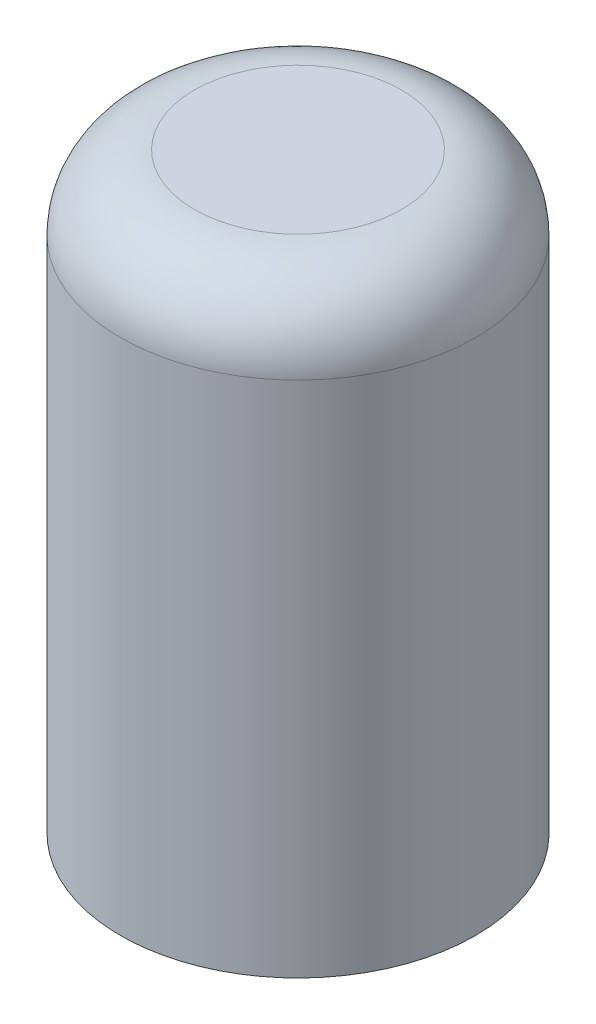
ISO-10303-21;
HEADER;
FILE_DESCRIPTION(('STEP AP214'),'2;1');
FILE_NAME('part.step','',(''),(''),'','','');
FILE_SCHEMA(('AUTOMOTIVE_DESIGN { 1 0 10303 214 1 1 1 1 }'));
ENDSEC;
DATA;
#1=APPLICATION_CONTEXT('core data for automotive mechanical design processes');
#2=APPLICATION_PROTOCOL_DEFINITION('international standard','automotive_design',2000,#1);
#3=PRODUCT_CONTEXT('',#1,'mechanical');
#4=PRODUCT('Part','Part','',(#3));
#5=PRODUCT_RELATED_PRODUCT_CATEGORY('part','',(#4));
#6=PRODUCT_DEFINITION_FORMATION('','',#4);
#7=PRODUCT_DEFINITION_CONTEXT('part definition',#1,'design');
#8=PRODUCT_DEFINITION('design','',#6,#7);
#9=PRODUCT_DEFINITION_SHAPE('','',#8);
#10=(LENGTH_UNIT() NAMED_UNIT(*) SI_UNIT(.MILLI.,.METRE.));
#11=(NAMED_UNIT(*) PLANE_ANGLE_UNIT() SI_UNIT($,.RADIAN.));
#12=(NAMED_UNIT(*) SI_UNIT($,.STERADIAN.) SOLID_ANGLE_UNIT());
#13=UNCERTAINTY_MEASURE_WITH_UNIT(LENGTH_MEASURE(1.E-05),#10,'distance_accuracy_value','');
#14=(GEOMETRIC_REPRESENTATION_CONTEXT(3) GLOBAL_UNCERTAINTY_ASSIGNED_CONTEXT((#13)) GLOBAL_UNIT_ASSIGNED_CONTEXT((#10,
#11,#12)) REPRESENTATION_CONTEXT('',''));
#15=CARTESIAN_POINT('',(0.,0.,0.));
#16=DIRECTION('',(0.,0.,1.));
#17=DIRECTION('',(1.,0.,0.));
#18=AXIS2_PLACEMENT_3D('',#15,#16,#17);
#19=CARTESIAN_POINT('',(0.,0.,0.));
#20=DIRECTION('',(0.,1.,0.));
#21=DIRECTION('',(-1.,0.,0.));
#22=AXIS2_PLACEMENT_3D('',#19,#20,#21);
#23=PLANE('',#22);
#24=CARTESIAN_POINT('',(0.,0.,0.));
#25=DIRECTION('',(0.,1.,0.));
#26=DIRECTION('',(-1.,0.,0.));
#27=AXIS2_PLACEMENT_3D('',#24,#25,#26);
#28=CIRCLE('',#27,57.9999999999998);
#29=CARTESIAN_POINT('',(-57.9999999999998,2.56578741862219E-13,0.));
#30=VERTEX_POINT('',#29);
#31=EDGE_CURVE('E45',#30,#30,#28,.T.);
#32=ORIENTED_EDGE('',*,*,#31,.T.);
#33=EDGE_LOOP('',(#32));
#34=FACE_BOUND('',#33,.T.);
#35=CARTESIAN_POINT('',(0.,1.66533453693773E-13,0.));
#36=DIRECTION('',(0.,1.,0.));
#37=DIRECTION('',(-1.,0.,0.));
#38=AXIS2_PLACEMENT_3D('',#35,#36,#37);
#39=CIRCLE('',#38,60.0000000000001);
#40=CARTESIAN_POINT('',(-60.0000000000001,3.45821745088946E-13,0.));
#41=VERTEX_POINT('',#40);
#42=EDGE_CURVE('E10',#41,#41,#39,.T.);
#43=ORIENTED_EDGE('',*,*,#42,.F.);
#44=EDGE_LOOP('',(#43));
#45=FACE_BOUND('',#44,.T.);
#46=ADVANCED_FACE('F31',(#34,#45),#23,.F.);
#47=CARTESIAN_POINT('',(5.97627637983908E-13,200.,0.));
#48=DIRECTION('',(0.,1.,0.));
#49=DIRECTION('',(-1.,0.,0.));
#50=AXIS2_PLACEMENT_3D('',#47,#48,#49);
#51=CYLINDRICAL_SURFACE('',#50,59.9999999999998);
#52=CARTESIAN_POINT('',(5.2292418323592E-13,175.,0.));
#53=DIRECTION('',(0.,1.,0.));
#54=DIRECTION('',(-1.,0.,0.));
#55=AXIS2_PLACEMENT_3D('',#52,#53,#54);
#56=CIRCLE('',#55,59.9999999999995);
#57=CARTESIAN_POINT('',(-59.999999999999,175.,0.));
#58=VERTEX_POINT('',#57);
#59=EDGE_CURVE('E37',#58,#58,#56,.T.);
#60=ORIENTED_EDGE('',*,*,#59,.F.);
#61=EDGE_LOOP('',(#60));
#62=FACE_BOUND('',#61,.T.);
#63=ORIENTED_EDGE('',*,*,#42,.T.);
#64=EDGE_LOOP('',(#63));
#65=FACE_BOUND('',#64,.T.);
#66=ADVANCED_FACE('F74',(#62,#65),#51,.T.);
#67=CARTESIAN_POINT('',(5.20417042793042E-13,175.,0.));
#68=DIRECTION('',(0.,1.,0.));
#69=DIRECTION('',(-1.,0.,0.));
#70=AXIS2_PLACEMENT_3D('',#67,#68,#69);
#71=TOROIDAL_SURFACE('',#70,34.9999999999995,25.);
#72=CARTESIAN_POINT('',(5.97627637983908E-13,200.,0.));
#73=DIRECTION('',(0.,1.,0.));
#74=DIRECTION('',(-1.,0.,0.));
#75=AXIS2_PLACEMENT_3D('',#72,#73,#74);
#76=CIRCLE('',#75,34.9999999999994);
#77=CARTESIAN_POINT('',(-34.9999999999988,200.,0.));
#78=VERTEX_POINT('',#77);
#79=EDGE_CURVE('E41',#78,#78,#76,.T.);
#80=ORIENTED_EDGE('',*,*,#79,.F.);
#81=EDGE_LOOP('',(#80));
#82=FACE_BOUND('',#81,.T.);
#83=ORIENTED_EDGE('',*,*,#59,.T.);
#84=EDGE_LOOP('',(#83));
#85=FACE_BOUND('',#84,.T.);
#86=ADVANCED_FACE('F79',(#82,#85),#71,.T.);
#87=CARTESIAN_POINT('',(35.,200.,0.));
#88=DIRECTION('',(0.,-1.,0.));
#89=DIRECTION('',(1.,0.,0.));
#90=AXIS2_PLACEMENT_3D('',#87,#88,#89);
#91=PLANE('',#90);
#92=ORIENTED_EDGE('',*,*,#79,.T.);
#93=EDGE_LOOP('',(#92));
#94=FACE_BOUND('',#93,.T.);
#95=ADVANCED_FACE('F71',(#94),#91,.F.);
#96=CARTESIAN_POINT('',(5.97627637983908E-13,200.,0.));
#97=DIRECTION('',(0.,1.,0.));
#98=DIRECTION('',(-1.,0.,0.));
#99=AXIS2_PLACEMENT_3D('',#96,#97,#98);
#100=CYLINDRICAL_SURFACE('',#99,57.9999999999998);
#101=CARTESIAN_POINT('',(5.20417042793042E-13,175.,0.));
#102=DIRECTION('',(0.,1.,0.));
#103=DIRECTION('',(-1.,0.,0.));
#104=AXIS2_PLACEMENT_3D('',#101,#102,#103);
#105=CIRCLE('',#104,57.9999999999995);
#106=CARTESIAN_POINT('',(-57.999999999999,175.,0.));
#107=VERTEX_POINT('',#106);
#108=EDGE_CURVE('E50',#107,#107,#105,.T.);
#109=ORIENTED_EDGE('',*,*,#108,.T.);
#110=EDGE_LOOP('',(#109));
#111=FACE_BOUND('',#110,.T.);
#112=ORIENTED_EDGE('',*,*,#31,.F.);
#113=EDGE_LOOP('',(#112));
#114=FACE_BOUND('',#113,.T.);
#115=ADVANCED_FACE('F57',(#111,#114),#100,.F.);
#116=CARTESIAN_POINT('',(5.20417042793042E-13,175.,0.));
#117=DIRECTION('',(0.,1.,0.));
#118=DIRECTION('',(-1.,0.,0.));
#119=AXIS2_PLACEMENT_3D('',#116,#117,#118);
#120=TOROIDAL_SURFACE('',#119,34.9999999999995,23.);
#121=CARTESIAN_POINT('',(5.89144221161192E-13,198.,0.));
#122=DIRECTION('',(0.,1.,0.));
#123=DIRECTION('',(-1.,0.,0.));
#124=AXIS2_PLACEMENT_3D('',#121,#122,#123);
#125=CIRCLE('',#124,34.9999999999994);
#126=CARTESIAN_POINT('',(-34.9999999999988,198.,0.));
#127=VERTEX_POINT('',#126);
#128=EDGE_CURVE('E51',#127,#127,#125,.T.);
#129=ORIENTED_EDGE('',*,*,#128,.T.);
#130=EDGE_LOOP('',(#129));
#131=FACE_BOUND('',#130,.T.);
#132=ORIENTED_EDGE('',*,*,#108,.F.);
#133=EDGE_LOOP('',(#132));
#134=FACE_BOUND('',#133,.T.);
#135=ADVANCED_FACE('F60',(#131,#134),#120,.F.);
#136=CARTESIAN_POINT('',(35.,198.,0.));
#137=DIRECTION('',(0.,-1.,0.));
#138=DIRECTION('',(1.,0.,0.));
#139=AXIS2_PLACEMENT_3D('',#136,#137,#138);
#140=PLANE('',#139);
#141=ORIENTED_EDGE('',*,*,#128,.F.);
#142=EDGE_LOOP('',(#141));
#143=FACE_BOUND('',#142,.T.);
#144=ADVANCED_FACE('F62',(#143),#140,.T.);
#145=CLOSED_SHELL('',(#46,#66,#86,#95,#115,#135,#144));
#146=MANIFOLD_SOLID_BREP('B2',#145);
#147=ADVANCED_BREP_SHAPE_REPRESENTATION('',(#18,#146),#14);
#148=SHAPE_DEFINITION_REPRESENTATION(#9,#147);
ENDSEC;
END-ISO-10303-21;
